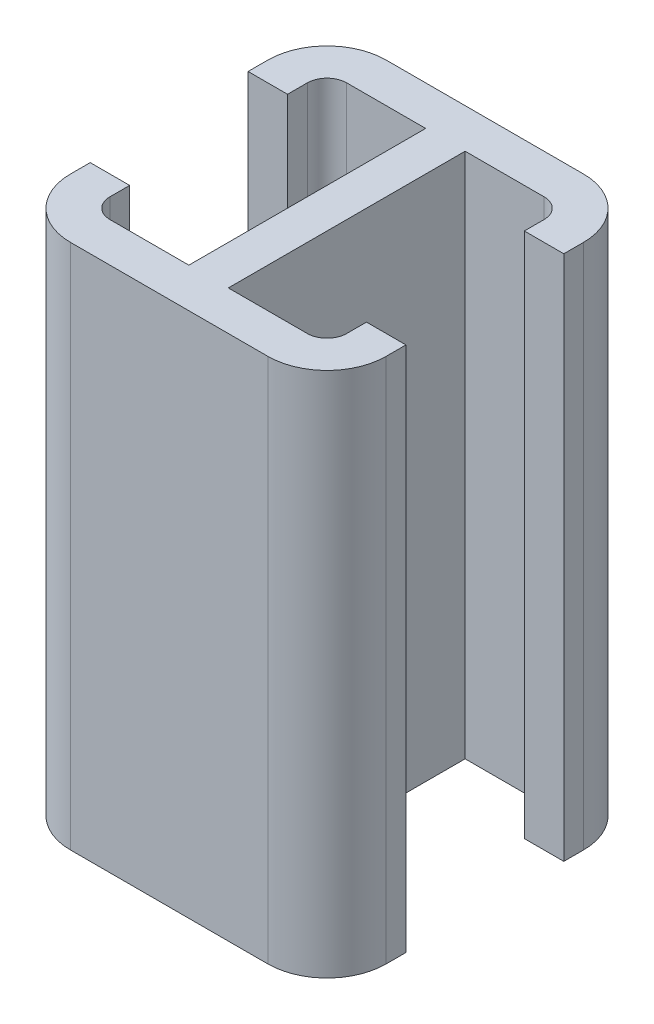
ISO-10303-21;
HEADER;
FILE_DESCRIPTION(('STEP AP214'),'2;1');
FILE_NAME('part.step','',(''),(''),'','','');
FILE_SCHEMA(('AUTOMOTIVE_DESIGN { 1 0 10303 214 1 1 1 1 }'));
ENDSEC;
DATA;
#1=APPLICATION_CONTEXT('core data for automotive mechanical design processes');
#2=APPLICATION_PROTOCOL_DEFINITION('international standard','automotive_design',2000,#1);
#3=PRODUCT_CONTEXT('',#1,'mechanical');
#4=PRODUCT('Part','Part','',(#3));
#5=PRODUCT_RELATED_PRODUCT_CATEGORY('part','',(#4));
#6=PRODUCT_DEFINITION_FORMATION('','',#4);
#7=PRODUCT_DEFINITION_CONTEXT('part definition',#1,'design');
#8=PRODUCT_DEFINITION('design','',#6,#7);
#9=PRODUCT_DEFINITION_SHAPE('','',#8);
#10=(LENGTH_UNIT() NAMED_UNIT(*) SI_UNIT(.MILLI.,.METRE.));
#11=(NAMED_UNIT(*) PLANE_ANGLE_UNIT() SI_UNIT($,.RADIAN.));
#12=(NAMED_UNIT(*) SI_UNIT($,.STERADIAN.) SOLID_ANGLE_UNIT());
#13=UNCERTAINTY_MEASURE_WITH_UNIT(LENGTH_MEASURE(1.E-05),#10,'distance_accuracy_value','');
#14=(GEOMETRIC_REPRESENTATION_CONTEXT(3) GLOBAL_UNCERTAINTY_ASSIGNED_CONTEXT((#13)) GLOBAL_UNIT_ASSIGNED_CONTEXT((#10,
#11,#12)) REPRESENTATION_CONTEXT('',''));
#15=CARTESIAN_POINT('',(0.,0.,0.));
#16=DIRECTION('',(0.,0.,1.));
#17=DIRECTION('',(1.,0.,0.));
#18=AXIS2_PLACEMENT_3D('',#15,#16,#17);
#19=CARTESIAN_POINT('',(0.,200.,0.));
#20=DIRECTION('',(1.,0.,0.));
#21=DIRECTION('',(0.,0.,-1.));
#22=AXIS2_PLACEMENT_3D('',#19,#20,#21);
#23=PLANE('',#22);
#24=DIRECTION('',(0.,0.,1.));
#25=VECTOR('',#24,1.);
#26=CARTESIAN_POINT('',(0.,0.,0.));
#27=LINE('',#26,#25);
#28=CARTESIAN_POINT('',(0.,0.,-30.));
#29=VERTEX_POINT('',#28);
#30=CARTESIAN_POINT('',(0.,0.,-22.5));
#31=VERTEX_POINT('',#30);
#32=EDGE_CURVE('E314',#29,#31,#27,.T.);
#33=ORIENTED_EDGE('',*,*,#32,.T.);
#34=DIRECTION('',(0.,-1.,0.));
#35=VECTOR('',#34,1.);
#36=CARTESIAN_POINT('',(0.,200.,-22.5));
#37=LINE('',#36,#35);
#38=CARTESIAN_POINT('',(0.,200.,-22.5));
#39=VERTEX_POINT('',#38);
#40=EDGE_CURVE('E462',#31,#39,#37,.F.);
#41=ORIENTED_EDGE('',*,*,#40,.T.);
#42=DIRECTION('',(0.,0.,1.));
#43=VECTOR('',#42,1.);
#44=CARTESIAN_POINT('',(0.,200.,0.));
#45=LINE('',#44,#43);
#46=CARTESIAN_POINT('',(0.,200.,-30.));
#47=VERTEX_POINT('',#46);
#48=EDGE_CURVE('E380',#47,#39,#45,.T.);
#49=ORIENTED_EDGE('',*,*,#48,.F.);
#50=DIRECTION('',(0.,-1.,0.));
#51=VECTOR('',#50,1.);
#52=CARTESIAN_POINT('',(0.,200.,-30.));
#53=LINE('',#52,#51);
#54=EDGE_CURVE('E313',#47,#29,#53,.T.);
#55=ORIENTED_EDGE('',*,*,#54,.T.);
#56=EDGE_LOOP('',(#33,#41,#49,#55));
#57=FACE_BOUND('',#56,.T.);
#58=ADVANCED_FACE('F42',(#57),#23,.F.);
#59=CARTESIAN_POINT('',(0.,200.,0.));
#60=DIRECTION('',(0.,0.,-1.));
#61=DIRECTION('',(-1.,0.,0.));
#62=AXIS2_PLACEMENT_3D('',#59,#60,#61);
#63=PLANE('',#62);
#64=DIRECTION('',(1.,0.,0.));
#65=VECTOR('',#64,1.);
#66=CARTESIAN_POINT('',(0.,200.,0.));
#67=LINE('',#66,#65);
#68=CARTESIAN_POINT('',(22.5,200.,0.));
#69=VERTEX_POINT('',#68);
#70=CARTESIAN_POINT('',(97.5,200.,0.));
#71=VERTEX_POINT('',#70);
#72=EDGE_CURVE('E242',#69,#71,#67,.T.);
#73=ORIENTED_EDGE('',*,*,#72,.F.);
#74=DIRECTION('',(0.,-1.,0.));
#75=VECTOR('',#74,1.);
#76=CARTESIAN_POINT('',(22.5,200.,0.));
#77=LINE('',#76,#75);
#78=CARTESIAN_POINT('',(22.5,0.,0.));
#79=VERTEX_POINT('',#78);
#80=EDGE_CURVE('E458',#69,#79,#77,.T.);
#81=ORIENTED_EDGE('',*,*,#80,.T.);
#82=DIRECTION('',(1.,0.,0.));
#83=VECTOR('',#82,1.);
#84=CARTESIAN_POINT('',(0.,0.,0.));
#85=LINE('',#84,#83);
#86=CARTESIAN_POINT('',(97.5,0.,0.));
#87=VERTEX_POINT('',#86);
#88=EDGE_CURVE('E318',#79,#87,#85,.T.);
#89=ORIENTED_EDGE('',*,*,#88,.T.);
#90=DIRECTION('',(0.,-1.,0.));
#91=VECTOR('',#90,1.);
#92=CARTESIAN_POINT('',(97.5,200.,0.));
#93=LINE('',#92,#91);
#94=EDGE_CURVE('E455',#87,#71,#93,.F.);
#95=ORIENTED_EDGE('',*,*,#94,.T.);
#96=EDGE_LOOP('',(#73,#81,#89,#95));
#97=FACE_BOUND('',#96,.T.);
#98=ADVANCED_FACE('F601',(#97),#63,.F.);
#99=CARTESIAN_POINT('',(120.,200.,0.));
#100=DIRECTION('',(-1.,0.,0.));
#101=DIRECTION('',(0.,0.,1.));
#102=AXIS2_PLACEMENT_3D('',#99,#100,#101);
#103=PLANE('',#102);
#104=DIRECTION('',(0.,0.,-1.));
#105=VECTOR('',#104,1.);
#106=CARTESIAN_POINT('',(120.,200.,0.));
#107=LINE('',#106,#105);
#108=CARTESIAN_POINT('',(120.,200.,-22.5));
#109=VERTEX_POINT('',#108);
#110=CARTESIAN_POINT('',(120.,200.,-30.));
#111=VERTEX_POINT('',#110);
#112=EDGE_CURVE('E227',#109,#111,#107,.T.);
#113=ORIENTED_EDGE('',*,*,#112,.F.);
#114=DIRECTION('',(0.,-1.,0.));
#115=VECTOR('',#114,1.);
#116=CARTESIAN_POINT('',(120.,200.,-22.5));
#117=LINE('',#116,#115);
#118=CARTESIAN_POINT('',(120.,0.,-22.5));
#119=VERTEX_POINT('',#118);
#120=EDGE_CURVE('E465',#109,#119,#117,.T.);
#121=ORIENTED_EDGE('',*,*,#120,.T.);
#122=DIRECTION('',(0.,0.,-1.));
#123=VECTOR('',#122,1.);
#124=CARTESIAN_POINT('',(120.,0.,0.));
#125=LINE('',#124,#123);
#126=CARTESIAN_POINT('',(120.,0.,-30.));
#127=VERTEX_POINT('',#126);
#128=EDGE_CURVE('E248',#119,#127,#125,.T.);
#129=ORIENTED_EDGE('',*,*,#128,.T.);
#130=DIRECTION('',(0.,-1.,0.));
#131=VECTOR('',#130,1.);
#132=CARTESIAN_POINT('',(120.,200.,-30.));
#133=LINE('',#132,#131);
#134=EDGE_CURVE('E245',#111,#127,#133,.T.);
#135=ORIENTED_EDGE('',*,*,#134,.F.);
#136=EDGE_LOOP('',(#113,#121,#129,#135));
#137=FACE_BOUND('',#136,.T.);
#138=ADVANCED_FACE('F246',(#137),#103,.F.);
#139=CARTESIAN_POINT('',(105.,200.,-30.));
#140=DIRECTION('',(0.,0.,1.));
#141=DIRECTION('',(1.,0.,0.));
#142=AXIS2_PLACEMENT_3D('',#139,#140,#141);
#143=PLANE('',#142);
#144=DIRECTION('',(-1.,0.,0.));
#145=VECTOR('',#144,1.);
#146=CARTESIAN_POINT('',(105.,0.,-30.));
#147=LINE('',#146,#145);
#148=CARTESIAN_POINT('',(105.,0.,-30.));
#149=VERTEX_POINT('',#148);
#150=EDGE_CURVE('E324',#127,#149,#147,.T.);
#151=ORIENTED_EDGE('',*,*,#150,.T.);
#152=DIRECTION('',(0.,-1.,0.));
#153=VECTOR('',#152,1.);
#154=CARTESIAN_POINT('',(105.,200.,-30.));
#155=LINE('',#154,#153);
#156=CARTESIAN_POINT('',(105.,200.,-30.));
#157=VERTEX_POINT('',#156);
#158=EDGE_CURVE('E253',#157,#149,#155,.T.);
#159=ORIENTED_EDGE('',*,*,#158,.F.);
#160=DIRECTION('',(-1.,0.,0.));
#161=VECTOR('',#160,1.);
#162=CARTESIAN_POINT('',(105.,200.,-30.));
#163=LINE('',#162,#161);
#164=EDGE_CURVE('E233',#111,#157,#163,.T.);
#165=ORIENTED_EDGE('',*,*,#164,.F.);
#166=ORIENTED_EDGE('',*,*,#134,.T.);
#167=EDGE_LOOP('',(#151,#159,#165,#166));
#168=FACE_BOUND('',#167,.T.);
#169=ADVANCED_FACE('F255',(#168),#143,.F.);
#170=CARTESIAN_POINT('',(105.,200.,-30.));
#171=DIRECTION('',(1.,0.,0.));
#172=DIRECTION('',(0.,0.,-1.));
#173=AXIS2_PLACEMENT_3D('',#170,#171,#172);
#174=PLANE('',#173);
#175=DIRECTION('',(0.,0.,1.));
#176=VECTOR('',#175,1.);
#177=CARTESIAN_POINT('',(105.,0.,-30.));
#178=LINE('',#177,#176);
#179=CARTESIAN_POINT('',(105.,0.,-22.5));
#180=VERTEX_POINT('',#179);
#181=EDGE_CURVE('E327',#149,#180,#178,.T.);
#182=ORIENTED_EDGE('',*,*,#181,.T.);
#183=DIRECTION('',(0.,-1.,0.));
#184=VECTOR('',#183,1.);
#185=CARTESIAN_POINT('',(105.,200.,-22.5));
#186=LINE('',#185,#184);
#187=CARTESIAN_POINT('',(105.,200.,-22.5));
#188=VERTEX_POINT('',#187);
#189=EDGE_CURVE('E482',#180,#188,#186,.F.);
#190=ORIENTED_EDGE('',*,*,#189,.T.);
#191=DIRECTION('',(0.,0.,1.));
#192=VECTOR('',#191,1.);
#193=CARTESIAN_POINT('',(105.,200.,-30.));
#194=LINE('',#193,#192);
#195=EDGE_CURVE('E259',#157,#188,#194,.T.);
#196=ORIENTED_EDGE('',*,*,#195,.F.);
#197=ORIENTED_EDGE('',*,*,#158,.T.);
#198=EDGE_LOOP('',(#182,#190,#196,#197));
#199=FACE_BOUND('',#198,.T.);
#200=ADVANCED_FACE('F591',(#199),#174,.F.);
#201=CARTESIAN_POINT('',(67.5,200.,-15.));
#202=DIRECTION('',(0.,0.,1.));
#203=DIRECTION('',(1.,0.,0.));
#204=AXIS2_PLACEMENT_3D('',#201,#202,#203);
#205=PLANE('',#204);
#206=DIRECTION('',(-1.,0.,0.));
#207=VECTOR('',#206,1.);
#208=CARTESIAN_POINT('',(67.5,200.,-15.));
#209=LINE('',#208,#207);
#210=CARTESIAN_POINT('',(97.5,200.,-15.));
#211=VERTEX_POINT('',#210);
#212=CARTESIAN_POINT('',(67.5,200.,-15.));
#213=VERTEX_POINT('',#212);
#214=EDGE_CURVE('E262',#211,#213,#209,.T.);
#215=ORIENTED_EDGE('',*,*,#214,.F.);
#216=DIRECTION('',(0.,-1.,0.));
#217=VECTOR('',#216,1.);
#218=CARTESIAN_POINT('',(97.5,0.,-15.));
#219=LINE('',#218,#217);
#220=CARTESIAN_POINT('',(97.5,0.,-15.));
#221=VERTEX_POINT('',#220);
#222=EDGE_CURVE('E478',#211,#221,#219,.T.);
#223=ORIENTED_EDGE('',*,*,#222,.T.);
#224=DIRECTION('',(-1.,0.,0.));
#225=VECTOR('',#224,1.);
#226=CARTESIAN_POINT('',(67.5,0.,-15.));
#227=LINE('',#226,#225);
#228=CARTESIAN_POINT('',(67.5,0.,-15.));
#229=VERTEX_POINT('',#228);
#230=EDGE_CURVE('E331',#221,#229,#227,.T.);
#231=ORIENTED_EDGE('',*,*,#230,.T.);
#232=DIRECTION('',(0.,-1.,0.));
#233=VECTOR('',#232,1.);
#234=CARTESIAN_POINT('',(67.5,200.,-15.));
#235=LINE('',#234,#233);
#236=EDGE_CURVE('E416',#213,#229,#235,.T.);
#237=ORIENTED_EDGE('',*,*,#236,.F.);
#238=EDGE_LOOP('',(#215,#223,#231,#237));
#239=FACE_BOUND('',#238,.T.);
#240=ADVANCED_FACE('F583',(#239),#205,.F.);
#241=CARTESIAN_POINT('',(67.5,200.,-105.));
#242=DIRECTION('',(-1.,0.,0.));
#243=DIRECTION('',(0.,0.,1.));
#244=AXIS2_PLACEMENT_3D('',#241,#242,#243);
#245=PLANE('',#244);
#246=DIRECTION('',(0.,0.,-1.));
#247=VECTOR('',#246,1.);
#248=CARTESIAN_POINT('',(67.5,0.,-105.));
#249=LINE('',#248,#247);
#250=CARTESIAN_POINT('',(67.5,0.,-105.));
#251=VERTEX_POINT('',#250);
#252=EDGE_CURVE('E334',#229,#251,#249,.T.);
#253=ORIENTED_EDGE('',*,*,#252,.T.);
#254=DIRECTION('',(0.,-1.,0.));
#255=VECTOR('',#254,1.);
#256=CARTESIAN_POINT('',(67.5,200.,-105.));
#257=LINE('',#256,#255);
#258=CARTESIAN_POINT('',(67.5,200.,-105.));
#259=VERTEX_POINT('',#258);
#260=EDGE_CURVE('E412',#259,#251,#257,.T.);
#261=ORIENTED_EDGE('',*,*,#260,.F.);
#262=DIRECTION('',(0.,0.,-1.));
#263=VECTOR('',#262,1.);
#264=CARTESIAN_POINT('',(67.5,200.,-105.));
#265=LINE('',#264,#263);
#266=EDGE_CURVE('E268',#213,#259,#265,.T.);
#267=ORIENTED_EDGE('',*,*,#266,.F.);
#268=ORIENTED_EDGE('',*,*,#236,.T.);
#269=EDGE_LOOP('',(#253,#261,#267,#268));
#270=FACE_BOUND('',#269,.T.);
#271=ADVANCED_FACE('F579',(#270),#245,.F.);
#272=CARTESIAN_POINT('',(67.5,200.,-105.));
#273=DIRECTION('',(0.,0.,-1.));
#274=DIRECTION('',(-1.,0.,0.));
#275=AXIS2_PLACEMENT_3D('',#272,#273,#274);
#276=PLANE('',#275);
#277=DIRECTION('',(1.,0.,0.));
#278=VECTOR('',#277,1.);
#279=CARTESIAN_POINT('',(67.5,0.,-105.));
#280=LINE('',#279,#278);
#281=CARTESIAN_POINT('',(97.5,0.,-105.));
#282=VERTEX_POINT('',#281);
#283=EDGE_CURVE('E337',#251,#282,#280,.T.);
#284=ORIENTED_EDGE('',*,*,#283,.T.);
#285=DIRECTION('',(0.,-1.,0.));
#286=VECTOR('',#285,1.);
#287=CARTESIAN_POINT('',(97.5,200.,-105.));
#288=LINE('',#287,#286);
#289=CARTESIAN_POINT('',(97.5,200.,-105.));
#290=VERTEX_POINT('',#289);
#291=EDGE_CURVE('E58',#282,#290,#288,.F.);
#292=ORIENTED_EDGE('',*,*,#291,.T.);
#293=DIRECTION('',(1.,0.,0.));
#294=VECTOR('',#293,1.);
#295=CARTESIAN_POINT('',(67.5,200.,-105.));
#296=LINE('',#295,#294);
#297=EDGE_CURVE('E271',#259,#290,#296,.T.);
#298=ORIENTED_EDGE('',*,*,#297,.F.);
#299=ORIENTED_EDGE('',*,*,#260,.T.);
#300=EDGE_LOOP('',(#284,#292,#298,#299));
#301=FACE_BOUND('',#300,.T.);
#302=ADVANCED_FACE('F575',(#301),#276,.F.);
#303=CARTESIAN_POINT('',(105.,200.,-105.));
#304=DIRECTION('',(1.,0.,0.));
#305=DIRECTION('',(0.,0.,-1.));
#306=AXIS2_PLACEMENT_3D('',#303,#304,#305);
#307=PLANE('',#306);
#308=DIRECTION('',(0.,0.,1.));
#309=VECTOR('',#308,1.);
#310=CARTESIAN_POINT('',(105.,200.,-105.));
#311=LINE('',#310,#309);
#312=CARTESIAN_POINT('',(105.,200.,-97.5));
#313=VERTEX_POINT('',#312);
#314=CARTESIAN_POINT('',(105.,200.,-90.));
#315=VERTEX_POINT('',#314);
#316=EDGE_CURVE('E274',#313,#315,#311,.T.);
#317=ORIENTED_EDGE('',*,*,#316,.F.);
#318=DIRECTION('',(0.,-1.,0.));
#319=VECTOR('',#318,1.);
#320=CARTESIAN_POINT('',(105.,0.,-97.5));
#321=LINE('',#320,#319);
#322=CARTESIAN_POINT('',(105.,0.,-97.5));
#323=VERTEX_POINT('',#322);
#324=EDGE_CURVE('E492',#313,#323,#321,.T.);
#325=ORIENTED_EDGE('',*,*,#324,.T.);
#326=DIRECTION('',(0.,0.,1.));
#327=VECTOR('',#326,1.);
#328=CARTESIAN_POINT('',(105.,0.,-105.));
#329=LINE('',#328,#327);
#330=CARTESIAN_POINT('',(105.,0.,-90.));
#331=VERTEX_POINT('',#330);
#332=EDGE_CURVE('E340',#323,#331,#329,.T.);
#333=ORIENTED_EDGE('',*,*,#332,.T.);
#334=DIRECTION('',(0.,-1.,0.));
#335=VECTOR('',#334,1.);
#336=CARTESIAN_POINT('',(105.,200.,-90.));
#337=LINE('',#336,#335);
#338=EDGE_CURVE('E408',#315,#331,#337,.T.);
#339=ORIENTED_EDGE('',*,*,#338,.F.);
#340=EDGE_LOOP('',(#317,#325,#333,#339));
#341=FACE_BOUND('',#340,.T.);
#342=ADVANCED_FACE('F569',(#341),#307,.F.);
#343=CARTESIAN_POINT('',(105.,200.,-90.));
#344=DIRECTION('',(0.,0.,-1.));
#345=DIRECTION('',(-1.,0.,0.));
#346=AXIS2_PLACEMENT_3D('',#343,#344,#345);
#347=PLANE('',#346);
#348=DIRECTION('',(1.,0.,0.));
#349=VECTOR('',#348,1.);
#350=CARTESIAN_POINT('',(105.,0.,-90.));
#351=LINE('',#350,#349);
#352=CARTESIAN_POINT('',(120.,0.,-90.));
#353=VERTEX_POINT('',#352);
#354=EDGE_CURVE('E343',#331,#353,#351,.T.);
#355=ORIENTED_EDGE('',*,*,#354,.T.);
#356=DIRECTION('',(0.,-1.,0.));
#357=VECTOR('',#356,1.);
#358=CARTESIAN_POINT('',(120.,200.,-90.));
#359=LINE('',#358,#357);
#360=CARTESIAN_POINT('',(120.,200.,-90.));
#361=VERTEX_POINT('',#360);
#362=EDGE_CURVE('E404',#361,#353,#359,.T.);
#363=ORIENTED_EDGE('',*,*,#362,.F.);
#364=DIRECTION('',(1.,0.,0.));
#365=VECTOR('',#364,1.);
#366=CARTESIAN_POINT('',(105.,200.,-90.));
#367=LINE('',#366,#365);
#368=EDGE_CURVE('E277',#315,#361,#367,.T.);
#369=ORIENTED_EDGE('',*,*,#368,.F.);
#370=ORIENTED_EDGE('',*,*,#338,.T.);
#371=EDGE_LOOP('',(#355,#363,#369,#370));
#372=FACE_BOUND('',#371,.T.);
#373=ADVANCED_FACE('F565',(#372),#347,.F.);
#374=CARTESIAN_POINT('',(120.,200.,-90.));
#375=DIRECTION('',(-1.,0.,0.));
#376=DIRECTION('',(0.,0.,1.));
#377=AXIS2_PLACEMENT_3D('',#374,#375,#376);
#378=PLANE('',#377);
#379=DIRECTION('',(0.,0.,-1.));
#380=VECTOR('',#379,1.);
#381=CARTESIAN_POINT('',(120.,0.,-90.));
#382=LINE('',#381,#380);
#383=CARTESIAN_POINT('',(120.,0.,-97.5));
#384=VERTEX_POINT('',#383);
#385=EDGE_CURVE('E346',#353,#384,#382,.T.);
#386=ORIENTED_EDGE('',*,*,#385,.T.);
#387=DIRECTION('',(0.,-1.,0.));
#388=VECTOR('',#387,1.);
#389=CARTESIAN_POINT('',(120.,200.,-97.5));
#390=LINE('',#389,#388);
#391=CARTESIAN_POINT('',(120.,200.,-97.5));
#392=VERTEX_POINT('',#391);
#393=EDGE_CURVE('E468',#384,#392,#390,.F.);
#394=ORIENTED_EDGE('',*,*,#393,.T.);
#395=DIRECTION('',(0.,0.,-1.));
#396=VECTOR('',#395,1.);
#397=CARTESIAN_POINT('',(120.,200.,-90.));
#398=LINE('',#397,#396);
#399=EDGE_CURVE('E280',#361,#392,#398,.T.);
#400=ORIENTED_EDGE('',*,*,#399,.F.);
#401=ORIENTED_EDGE('',*,*,#362,.T.);
#402=EDGE_LOOP('',(#386,#394,#400,#401));
#403=FACE_BOUND('',#402,.T.);
#404=ADVANCED_FACE('F561',(#403),#378,.F.);
#405=CARTESIAN_POINT('',(0.,200.,-120.));
#406=DIRECTION('',(0.,0.,1.));
#407=DIRECTION('',(1.,0.,0.));
#408=AXIS2_PLACEMENT_3D('',#405,#406,#407);
#409=PLANE('',#408);
#410=DIRECTION('',(-1.,0.,0.));
#411=VECTOR('',#410,1.);
#412=CARTESIAN_POINT('',(0.,0.,-120.));
#413=LINE('',#412,#411);
#414=CARTESIAN_POINT('',(97.5,0.,-120.));
#415=VERTEX_POINT('',#414);
#416=CARTESIAN_POINT('',(22.5,0.,-120.));
#417=VERTEX_POINT('',#416);
#418=EDGE_CURVE('E350',#415,#417,#413,.T.);
#419=ORIENTED_EDGE('',*,*,#418,.T.);
#420=DIRECTION('',(0.,-1.,0.));
#421=VECTOR('',#420,1.);
#422=CARTESIAN_POINT('',(22.5,200.,-120.));
#423=LINE('',#422,#421);
#424=CARTESIAN_POINT('',(22.5,200.,-120.));
#425=VERTEX_POINT('',#424);
#426=EDGE_CURVE('E441',#417,#425,#423,.F.);
#427=ORIENTED_EDGE('',*,*,#426,.T.);
#428=DIRECTION('',(-1.,0.,0.));
#429=VECTOR('',#428,1.);
#430=CARTESIAN_POINT('',(0.,200.,-120.));
#431=LINE('',#430,#429);
#432=CARTESIAN_POINT('',(97.5,200.,-120.));
#433=VERTEX_POINT('',#432);
#434=EDGE_CURVE('E284',#433,#425,#431,.T.);
#435=ORIENTED_EDGE('',*,*,#434,.F.);
#436=DIRECTION('',(0.,-1.,0.));
#437=VECTOR('',#436,1.);
#438=CARTESIAN_POINT('',(97.5,200.,-120.));
#439=LINE('',#438,#437);
#440=EDGE_CURVE('E437',#433,#415,#439,.T.);
#441=ORIENTED_EDGE('',*,*,#440,.T.);
#442=EDGE_LOOP('',(#419,#427,#435,#441));
#443=FACE_BOUND('',#442,.T.);
#444=ADVANCED_FACE('F551',(#443),#409,.F.);
#445=CARTESIAN_POINT('',(0.,200.,-90.));
#446=DIRECTION('',(1.,0.,0.));
#447=DIRECTION('',(0.,0.,-1.));
#448=AXIS2_PLACEMENT_3D('',#445,#446,#447);
#449=PLANE('',#448);
#450=DIRECTION('',(0.,0.,1.));
#451=VECTOR('',#450,1.);
#452=CARTESIAN_POINT('',(0.,200.,-90.));
#453=LINE('',#452,#451);
#454=CARTESIAN_POINT('',(0.,200.,-97.5));
#455=VERTEX_POINT('',#454);
#456=CARTESIAN_POINT('',(0.,200.,-90.));
#457=VERTEX_POINT('',#456);
#458=EDGE_CURVE('E287',#455,#457,#453,.T.);
#459=ORIENTED_EDGE('',*,*,#458,.F.);
#460=DIRECTION('',(0.,-1.,0.));
#461=VECTOR('',#460,1.);
#462=CARTESIAN_POINT('',(0.,200.,-97.5));
#463=LINE('',#462,#461);
#464=CARTESIAN_POINT('',(0.,0.,-97.5));
#465=VERTEX_POINT('',#464);
#466=EDGE_CURVE('E252',#455,#465,#463,.T.);
#467=ORIENTED_EDGE('',*,*,#466,.T.);
#468=DIRECTION('',(0.,0.,1.));
#469=VECTOR('',#468,1.);
#470=CARTESIAN_POINT('',(0.,0.,-90.));
#471=LINE('',#470,#469);
#472=CARTESIAN_POINT('',(0.,0.,-90.));
#473=VERTEX_POINT('',#472);
#474=EDGE_CURVE('E354',#465,#473,#471,.T.);
#475=ORIENTED_EDGE('',*,*,#474,.T.);
#476=DIRECTION('',(0.,-1.,0.));
#477=VECTOR('',#476,1.);
#478=CARTESIAN_POINT('',(0.,200.,-90.));
#479=LINE('',#478,#477);
#480=EDGE_CURVE('E400',#457,#473,#479,.T.);
#481=ORIENTED_EDGE('',*,*,#480,.F.);
#482=EDGE_LOOP('',(#459,#467,#475,#481));
#483=FACE_BOUND('',#482,.T.);
#484=ADVANCED_FACE('F543',(#483),#449,.F.);
#485=CARTESIAN_POINT('',(15.,200.,-90.));
#486=DIRECTION('',(0.,0.,-1.));
#487=DIRECTION('',(-1.,0.,0.));
#488=AXIS2_PLACEMENT_3D('',#485,#486,#487);
#489=PLANE('',#488);
#490=DIRECTION('',(1.,0.,0.));
#491=VECTOR('',#490,1.);
#492=CARTESIAN_POINT('',(15.,0.,-90.));
#493=LINE('',#492,#491);
#494=CARTESIAN_POINT('',(15.,0.,-90.));
#495=VERTEX_POINT('',#494);
#496=EDGE_CURVE('E357',#473,#495,#493,.T.);
#497=ORIENTED_EDGE('',*,*,#496,.T.);
#498=DIRECTION('',(0.,-1.,0.));
#499=VECTOR('',#498,1.);
#500=CARTESIAN_POINT('',(15.,200.,-90.));
#501=LINE('',#500,#499);
#502=CARTESIAN_POINT('',(15.,200.,-90.));
#503=VERTEX_POINT('',#502);
#504=EDGE_CURVE('E396',#503,#495,#501,.T.);
#505=ORIENTED_EDGE('',*,*,#504,.F.);
#506=DIRECTION('',(1.,0.,0.));
#507=VECTOR('',#506,1.);
#508=CARTESIAN_POINT('',(15.,200.,-90.));
#509=LINE('',#508,#507);
#510=EDGE_CURVE('E290',#457,#503,#509,.T.);
#511=ORIENTED_EDGE('',*,*,#510,.F.);
#512=ORIENTED_EDGE('',*,*,#480,.T.);
#513=EDGE_LOOP('',(#497,#505,#511,#512));
#514=FACE_BOUND('',#513,.T.);
#515=ADVANCED_FACE('F538',(#514),#489,.F.);
#516=CARTESIAN_POINT('',(15.,200.,-105.));
#517=DIRECTION('',(-1.,0.,0.));
#518=DIRECTION('',(0.,0.,1.));
#519=AXIS2_PLACEMENT_3D('',#516,#517,#518);
#520=PLANE('',#519);
#521=DIRECTION('',(0.,0.,-1.));
#522=VECTOR('',#521,1.);
#523=CARTESIAN_POINT('',(15.,0.,-105.));
#524=LINE('',#523,#522);
#525=CARTESIAN_POINT('',(15.,0.,-97.5));
#526=VERTEX_POINT('',#525);
#527=EDGE_CURVE('E360',#495,#526,#524,.T.);
#528=ORIENTED_EDGE('',*,*,#527,.T.);
#529=DIRECTION('',(0.,-1.,0.));
#530=VECTOR('',#529,1.);
#531=CARTESIAN_POINT('',(15.,200.,-97.5));
#532=LINE('',#531,#530);
#533=CARTESIAN_POINT('',(15.,200.,-97.5));
#534=VERTEX_POINT('',#533);
#535=EDGE_CURVE('E489',#526,#534,#532,.F.);
#536=ORIENTED_EDGE('',*,*,#535,.T.);
#537=DIRECTION('',(0.,0.,-1.));
#538=VECTOR('',#537,1.);
#539=CARTESIAN_POINT('',(15.,200.,-105.));
#540=LINE('',#539,#538);
#541=EDGE_CURVE('E293',#503,#534,#540,.T.);
#542=ORIENTED_EDGE('',*,*,#541,.F.);
#543=ORIENTED_EDGE('',*,*,#504,.T.);
#544=EDGE_LOOP('',(#528,#536,#542,#543));
#545=FACE_BOUND('',#544,.T.);
#546=ADVANCED_FACE('F534',(#545),#520,.F.);
#547=CARTESIAN_POINT('',(52.5,200.,-105.));
#548=DIRECTION('',(0.,0.,-1.));
#549=DIRECTION('',(-1.,0.,0.));
#550=AXIS2_PLACEMENT_3D('',#547,#548,#549);
#551=PLANE('',#550);
#552=DIRECTION('',(1.,0.,0.));
#553=VECTOR('',#552,1.);
#554=CARTESIAN_POINT('',(52.5,200.,-105.));
#555=LINE('',#554,#553);
#556=CARTESIAN_POINT('',(22.5,200.,-105.));
#557=VERTEX_POINT('',#556);
#558=CARTESIAN_POINT('',(52.5,200.,-105.));
#559=VERTEX_POINT('',#558);
#560=EDGE_CURVE('E297',#557,#559,#555,.T.);
#561=ORIENTED_EDGE('',*,*,#560,.F.);
#562=DIRECTION('',(0.,-1.,0.));
#563=VECTOR('',#562,1.);
#564=CARTESIAN_POINT('',(22.5,0.,-105.));
#565=LINE('',#564,#563);
#566=CARTESIAN_POINT('',(22.5,0.,-105.));
#567=VERTEX_POINT('',#566);
#568=EDGE_CURVE('E485',#557,#567,#565,.T.);
#569=ORIENTED_EDGE('',*,*,#568,.T.);
#570=DIRECTION('',(1.,0.,0.));
#571=VECTOR('',#570,1.);
#572=CARTESIAN_POINT('',(52.5,0.,-105.));
#573=LINE('',#572,#571);
#574=CARTESIAN_POINT('',(52.5,0.,-105.));
#575=VERTEX_POINT('',#574);
#576=EDGE_CURVE('E364',#567,#575,#573,.T.);
#577=ORIENTED_EDGE('',*,*,#576,.T.);
#578=DIRECTION('',(0.,-1.,0.));
#579=VECTOR('',#578,1.);
#580=CARTESIAN_POINT('',(52.5,200.,-105.));
#581=LINE('',#580,#579);
#582=EDGE_CURVE('E392',#559,#575,#581,.T.);
#583=ORIENTED_EDGE('',*,*,#582,.F.);
#584=EDGE_LOOP('',(#561,#569,#577,#583));
#585=FACE_BOUND('',#584,.T.);
#586=ADVANCED_FACE('F524',(#585),#551,.F.);
#587=CARTESIAN_POINT('',(52.5,200.,-105.));
#588=DIRECTION('',(1.,0.,0.));
#589=DIRECTION('',(0.,0.,-1.));
#590=AXIS2_PLACEMENT_3D('',#587,#588,#589);
#591=PLANE('',#590);
#592=DIRECTION('',(0.,0.,1.));
#593=VECTOR('',#592,1.);
#594=CARTESIAN_POINT('',(52.5,0.,-105.));
#595=LINE('',#594,#593);
#596=CARTESIAN_POINT('',(52.5,0.,-15.));
#597=VERTEX_POINT('',#596);
#598=EDGE_CURVE('E367',#575,#597,#595,.T.);
#599=ORIENTED_EDGE('',*,*,#598,.T.);
#600=DIRECTION('',(0.,-1.,0.));
#601=VECTOR('',#600,1.);
#602=CARTESIAN_POINT('',(52.5,200.,-15.));
#603=LINE('',#602,#601);
#604=CARTESIAN_POINT('',(52.5,200.,-15.));
#605=VERTEX_POINT('',#604);
#606=EDGE_CURVE('E388',#605,#597,#603,.T.);
#607=ORIENTED_EDGE('',*,*,#606,.F.);
#608=DIRECTION('',(0.,0.,1.));
#609=VECTOR('',#608,1.);
#610=CARTESIAN_POINT('',(52.5,200.,-105.));
#611=LINE('',#610,#609);
#612=EDGE_CURVE('E300',#559,#605,#611,.T.);
#613=ORIENTED_EDGE('',*,*,#612,.F.);
#614=ORIENTED_EDGE('',*,*,#582,.T.);
#615=EDGE_LOOP('',(#599,#607,#613,#614));
#616=FACE_BOUND('',#615,.T.);
#617=ADVANCED_FACE('F698',(#616),#591,.F.);
#618=CARTESIAN_POINT('',(52.5,200.,-15.));
#619=DIRECTION('',(0.,0.,1.));
#620=DIRECTION('',(1.,0.,0.));
#621=AXIS2_PLACEMENT_3D('',#618,#619,#620);
#622=PLANE('',#621);
#623=DIRECTION('',(-1.,0.,0.));
#624=VECTOR('',#623,1.);
#625=CARTESIAN_POINT('',(52.5,0.,-15.));
#626=LINE('',#625,#624);
#627=CARTESIAN_POINT('',(22.5,0.,-15.));
#628=VERTEX_POINT('',#627);
#629=EDGE_CURVE('E370',#597,#628,#626,.T.);
#630=ORIENTED_EDGE('',*,*,#629,.T.);
#631=DIRECTION('',(0.,-1.,0.));
#632=VECTOR('',#631,1.);
#633=CARTESIAN_POINT('',(22.5,200.,-15.));
#634=LINE('',#633,#632);
#635=CARTESIAN_POINT('',(22.5,200.,-15.));
#636=VERTEX_POINT('',#635);
#637=EDGE_CURVE('E475',#628,#636,#634,.F.);
#638=ORIENTED_EDGE('',*,*,#637,.T.);
#639=DIRECTION('',(-1.,0.,0.));
#640=VECTOR('',#639,1.);
#641=CARTESIAN_POINT('',(52.5,200.,-15.));
#642=LINE('',#641,#640);
#643=EDGE_CURVE('E303',#605,#636,#642,.T.);
#644=ORIENTED_EDGE('',*,*,#643,.F.);
#645=ORIENTED_EDGE('',*,*,#606,.T.);
#646=EDGE_LOOP('',(#630,#638,#644,#645));
#647=FACE_BOUND('',#646,.T.);
#648=ADVANCED_FACE('F687',(#647),#622,.F.);
#649=CARTESIAN_POINT('',(15.,200.,-30.));
#650=DIRECTION('',(-1.,0.,0.));
#651=DIRECTION('',(0.,0.,1.));
#652=AXIS2_PLACEMENT_3D('',#649,#650,#651);
#653=PLANE('',#652);
#654=DIRECTION('',(0.,0.,-1.));
#655=VECTOR('',#654,1.);
#656=CARTESIAN_POINT('',(15.,200.,-30.));
#657=LINE('',#656,#655);
#658=CARTESIAN_POINT('',(15.,200.,-22.5));
#659=VERTEX_POINT('',#658);
#660=CARTESIAN_POINT('',(15.,200.,-30.));
#661=VERTEX_POINT('',#660);
#662=EDGE_CURVE('E307',#659,#661,#657,.T.);
#663=ORIENTED_EDGE('',*,*,#662,.F.);
#664=DIRECTION('',(0.,-1.,0.));
#665=VECTOR('',#664,1.);
#666=CARTESIAN_POINT('',(15.,0.,-22.5));
#667=LINE('',#666,#665);
#668=CARTESIAN_POINT('',(15.,0.,-22.5));
#669=VERTEX_POINT('',#668);
#670=EDGE_CURVE('E471',#659,#669,#667,.T.);
#671=ORIENTED_EDGE('',*,*,#670,.T.);
#672=DIRECTION('',(0.,0.,-1.));
#673=VECTOR('',#672,1.);
#674=CARTESIAN_POINT('',(15.,0.,-30.));
#675=LINE('',#674,#673);
#676=CARTESIAN_POINT('',(15.,0.,-30.));
#677=VERTEX_POINT('',#676);
#678=EDGE_CURVE('E374',#669,#677,#675,.T.);
#679=ORIENTED_EDGE('',*,*,#678,.T.);
#680=DIRECTION('',(0.,-1.,0.));
#681=VECTOR('',#680,1.);
#682=CARTESIAN_POINT('',(15.,200.,-30.));
#683=LINE('',#682,#681);
#684=EDGE_CURVE('E384',#661,#677,#683,.T.);
#685=ORIENTED_EDGE('',*,*,#684,.F.);
#686=EDGE_LOOP('',(#663,#671,#679,#685));
#687=FACE_BOUND('',#686,.T.);
#688=ADVANCED_FACE('F682',(#687),#653,.F.);
#689=CARTESIAN_POINT('',(15.,200.,-30.));
#690=DIRECTION('',(0.,0.,1.));
#691=DIRECTION('',(1.,0.,0.));
#692=AXIS2_PLACEMENT_3D('',#689,#690,#691);
#693=PLANE('',#692);
#694=DIRECTION('',(-1.,0.,0.));
#695=VECTOR('',#694,1.);
#696=CARTESIAN_POINT('',(15.,0.,-30.));
#697=LINE('',#696,#695);
#698=EDGE_CURVE('E377',#677,#29,#697,.T.);
#699=ORIENTED_EDGE('',*,*,#698,.T.);
#700=ORIENTED_EDGE('',*,*,#54,.F.);
#701=DIRECTION('',(-1.,0.,0.));
#702=VECTOR('',#701,1.);
#703=CARTESIAN_POINT('',(15.,200.,-30.));
#704=LINE('',#703,#702);
#705=EDGE_CURVE('E310',#661,#47,#704,.T.);
#706=ORIENTED_EDGE('',*,*,#705,.F.);
#707=ORIENTED_EDGE('',*,*,#684,.T.);
#708=EDGE_LOOP('',(#699,#700,#706,#707));
#709=FACE_BOUND('',#708,.T.);
#710=ADVANCED_FACE('F674',(#709),#693,.F.);
#711=CARTESIAN_POINT('',(0.,200.,0.));
#712=DIRECTION('',(0.,1.,0.));
#713=DIRECTION('',(0.,0.,1.));
#714=AXIS2_PLACEMENT_3D('',#711,#712,#713);
#715=PLANE('',#714);
#716=ORIENTED_EDGE('',*,*,#434,.T.);
#717=CARTESIAN_POINT('',(22.5,200.,-97.5));
#718=DIRECTION('',(0.,1.,0.));
#719=DIRECTION('',(0.,0.,1.));
#720=AXIS2_PLACEMENT_3D('',#717,#718,#719);
#721=CIRCLE('',#720,22.5);
#722=EDGE_CURVE('E452',#425,#455,#721,.T.);
#723=ORIENTED_EDGE('',*,*,#722,.T.);
#724=ORIENTED_EDGE('',*,*,#458,.T.);
#725=ORIENTED_EDGE('',*,*,#510,.T.);
#726=ORIENTED_EDGE('',*,*,#541,.T.);
#727=CARTESIAN_POINT('',(22.5,200.,-97.5));
#728=DIRECTION('',(0.,1.,0.));
#729=DIRECTION('',(0.,0.,1.));
#730=AXIS2_PLACEMENT_3D('',#727,#728,#729);
#731=CIRCLE('',#730,7.5);
#732=EDGE_CURVE('E513',#534,#557,#731,.F.);
#733=ORIENTED_EDGE('',*,*,#732,.T.);
#734=ORIENTED_EDGE('',*,*,#560,.T.);
#735=ORIENTED_EDGE('',*,*,#612,.T.);
#736=ORIENTED_EDGE('',*,*,#643,.T.);
#737=CARTESIAN_POINT('',(22.5,200.,-22.5));
#738=DIRECTION('',(0.,1.,0.));
#739=DIRECTION('',(0.,0.,1.));
#740=AXIS2_PLACEMENT_3D('',#737,#738,#739);
#741=CIRCLE('',#740,7.5);
#742=EDGE_CURVE('E501',#636,#659,#741,.F.);
#743=ORIENTED_EDGE('',*,*,#742,.T.);
#744=ORIENTED_EDGE('',*,*,#662,.T.);
#745=ORIENTED_EDGE('',*,*,#705,.T.);
#746=ORIENTED_EDGE('',*,*,#48,.T.);
#747=CARTESIAN_POINT('',(22.5,200.,-22.5));
#748=DIRECTION('',(0.,1.,0.));
#749=DIRECTION('',(0.,0.,1.));
#750=AXIS2_PLACEMENT_3D('',#747,#748,#749);
#751=CIRCLE('',#750,22.5);
#752=EDGE_CURVE('E449',#39,#69,#751,.T.);
#753=ORIENTED_EDGE('',*,*,#752,.T.);
#754=ORIENTED_EDGE('',*,*,#72,.T.);
#755=CARTESIAN_POINT('',(97.5,200.,-22.5));
#756=DIRECTION('',(0.,1.,0.));
#757=DIRECTION('',(0.,0.,1.));
#758=AXIS2_PLACEMENT_3D('',#755,#756,#757);
#759=CIRCLE('',#758,22.5);
#760=EDGE_CURVE('E237',#71,#109,#759,.T.);
#761=ORIENTED_EDGE('',*,*,#760,.T.);
#762=ORIENTED_EDGE('',*,*,#112,.T.);
#763=ORIENTED_EDGE('',*,*,#164,.T.);
#764=ORIENTED_EDGE('',*,*,#195,.T.);
#765=CARTESIAN_POINT('',(97.5,200.,-22.5));
#766=DIRECTION('',(0.,1.,0.));
#767=DIRECTION('',(0.,0.,1.));
#768=AXIS2_PLACEMENT_3D('',#765,#766,#767);
#769=CIRCLE('',#768,7.5);
#770=EDGE_CURVE('E507',#188,#211,#769,.F.);
#771=ORIENTED_EDGE('',*,*,#770,.T.);
#772=ORIENTED_EDGE('',*,*,#214,.T.);
#773=ORIENTED_EDGE('',*,*,#266,.T.);
#774=ORIENTED_EDGE('',*,*,#297,.T.);
#775=CARTESIAN_POINT('',(97.5,200.,-97.5));
#776=DIRECTION('',(0.,1.,0.));
#777=DIRECTION('',(0.,0.,1.));
#778=AXIS2_PLACEMENT_3D('',#775,#776,#777);
#779=CIRCLE('',#778,7.5);
#780=EDGE_CURVE('E11',#290,#313,#779,.F.);
#781=ORIENTED_EDGE('',*,*,#780,.T.);
#782=ORIENTED_EDGE('',*,*,#316,.T.);
#783=ORIENTED_EDGE('',*,*,#368,.T.);
#784=ORIENTED_EDGE('',*,*,#399,.T.);
#785=CARTESIAN_POINT('',(97.5,200.,-97.5));
#786=DIRECTION('',(0.,1.,0.));
#787=DIRECTION('',(0.,0.,1.));
#788=AXIS2_PLACEMENT_3D('',#785,#786,#787);
#789=CIRCLE('',#788,22.5);
#790=EDGE_CURVE('E444',#392,#433,#789,.T.);
#791=ORIENTED_EDGE('',*,*,#790,.T.);
#792=EDGE_LOOP('',(#716,#723,#724,#725,#726,#733,#734,#735,#736,#743,#744,#745,#746,#753,#754,
#761,#762,#763,#764,#771,#772,#773,#774,#781,#782,#783,#784,#791));
#793=FACE_BOUND('',#792,.T.);
#794=ADVANCED_FACE('F230',(#793),#715,.T.);
#795=CARTESIAN_POINT('',(0.,0.,0.));
#796=DIRECTION('',(0.,1.,0.));
#797=DIRECTION('',(0.,0.,1.));
#798=AXIS2_PLACEMENT_3D('',#795,#796,#797);
#799=PLANE('',#798);
#800=ORIENTED_EDGE('',*,*,#474,.F.);
#801=CARTESIAN_POINT('',(22.5,0.,-97.5));
#802=DIRECTION('',(0.,1.,0.));
#803=DIRECTION('',(0.,0.,1.));
#804=AXIS2_PLACEMENT_3D('',#801,#802,#803);
#805=CIRCLE('',#804,22.5);
#806=EDGE_CURVE('E434',#465,#417,#805,.F.);
#807=ORIENTED_EDGE('',*,*,#806,.T.);
#808=ORIENTED_EDGE('',*,*,#418,.F.);
#809=CARTESIAN_POINT('',(97.5,0.,-97.5));
#810=DIRECTION('',(0.,1.,0.));
#811=DIRECTION('',(0.,0.,1.));
#812=AXIS2_PLACEMENT_3D('',#809,#810,#811);
#813=CIRCLE('',#812,22.5);
#814=EDGE_CURVE('E425',#415,#384,#813,.F.);
#815=ORIENTED_EDGE('',*,*,#814,.T.);
#816=ORIENTED_EDGE('',*,*,#385,.F.);
#817=ORIENTED_EDGE('',*,*,#354,.F.);
#818=ORIENTED_EDGE('',*,*,#332,.F.);
#819=CARTESIAN_POINT('',(97.5,0.,-97.5));
#820=DIRECTION('',(0.,1.,0.));
#821=DIRECTION('',(0.,0.,1.));
#822=AXIS2_PLACEMENT_3D('',#819,#820,#821);
#823=CIRCLE('',#822,7.5);
#824=EDGE_CURVE('E51',#323,#282,#823,.T.);
#825=ORIENTED_EDGE('',*,*,#824,.T.);
#826=ORIENTED_EDGE('',*,*,#283,.F.);
#827=ORIENTED_EDGE('',*,*,#252,.F.);
#828=ORIENTED_EDGE('',*,*,#230,.F.);
#829=CARTESIAN_POINT('',(97.5,0.,-22.5));
#830=DIRECTION('',(0.,1.,0.));
#831=DIRECTION('',(0.,0.,1.));
#832=AXIS2_PLACEMENT_3D('',#829,#830,#831);
#833=CIRCLE('',#832,7.5);
#834=EDGE_CURVE('E504',#221,#180,#833,.T.);
#835=ORIENTED_EDGE('',*,*,#834,.T.);
#836=ORIENTED_EDGE('',*,*,#181,.F.);
#837=ORIENTED_EDGE('',*,*,#150,.F.);
#838=ORIENTED_EDGE('',*,*,#128,.F.);
#839=CARTESIAN_POINT('',(97.5,0.,-22.5));
#840=DIRECTION('',(0.,1.,0.));
#841=DIRECTION('',(0.,0.,1.));
#842=AXIS2_PLACEMENT_3D('',#839,#840,#841);
#843=CIRCLE('',#842,22.5);
#844=EDGE_CURVE('E428',#119,#87,#843,.F.);
#845=ORIENTED_EDGE('',*,*,#844,.T.);
#846=ORIENTED_EDGE('',*,*,#88,.F.);
#847=CARTESIAN_POINT('',(22.5,0.,-22.5));
#848=DIRECTION('',(0.,1.,0.));
#849=DIRECTION('',(0.,0.,1.));
#850=AXIS2_PLACEMENT_3D('',#847,#848,#849);
#851=CIRCLE('',#850,22.5);
#852=EDGE_CURVE('E431',#79,#31,#851,.F.);
#853=ORIENTED_EDGE('',*,*,#852,.T.);
#854=ORIENTED_EDGE('',*,*,#32,.F.);
#855=ORIENTED_EDGE('',*,*,#698,.F.);
#856=ORIENTED_EDGE('',*,*,#678,.F.);
#857=CARTESIAN_POINT('',(22.5,0.,-22.5));
#858=DIRECTION('',(0.,1.,0.));
#859=DIRECTION('',(0.,0.,1.));
#860=AXIS2_PLACEMENT_3D('',#857,#858,#859);
#861=CIRCLE('',#860,7.5);
#862=EDGE_CURVE('E498',#669,#628,#861,.T.);
#863=ORIENTED_EDGE('',*,*,#862,.T.);
#864=ORIENTED_EDGE('',*,*,#629,.F.);
#865=ORIENTED_EDGE('',*,*,#598,.F.);
#866=ORIENTED_EDGE('',*,*,#576,.F.);
#867=CARTESIAN_POINT('',(22.5,0.,-97.5));
#868=DIRECTION('',(0.,1.,0.));
#869=DIRECTION('',(0.,0.,1.));
#870=AXIS2_PLACEMENT_3D('',#867,#868,#869);
#871=CIRCLE('',#870,7.5);
#872=EDGE_CURVE('E510',#567,#526,#871,.T.);
#873=ORIENTED_EDGE('',*,*,#872,.T.);
#874=ORIENTED_EDGE('',*,*,#527,.F.);
#875=ORIENTED_EDGE('',*,*,#496,.F.);
#876=EDGE_LOOP('',(#800,#807,#808,#815,#816,#817,#818,#825,#826,#827,#828,#835,#836,#837,#838,
#845,#846,#853,#854,#855,#856,#863,#864,#865,#866,#873,#874,#875));
#877=FACE_BOUND('',#876,.T.);
#878=ADVANCED_FACE('F530',(#877),#799,.F.);
#879=CARTESIAN_POINT('',(22.5,200.,-97.5));
#880=DIRECTION('',(0.,-1.,0.));
#881=DIRECTION('',(0.,0.,-1.));
#882=AXIS2_PLACEMENT_3D('',#879,#880,#881);
#883=CYLINDRICAL_SURFACE('',#882,22.5);
#884=ORIENTED_EDGE('',*,*,#722,.F.);
#885=ORIENTED_EDGE('',*,*,#426,.F.);
#886=ORIENTED_EDGE('',*,*,#806,.F.);
#887=ORIENTED_EDGE('',*,*,#466,.F.);
#888=EDGE_LOOP('',(#884,#885,#886,#887));
#889=FACE_BOUND('',#888,.T.);
#890=ADVANCED_FACE('F547',(#889),#883,.T.);
#891=CARTESIAN_POINT('',(22.5,200.,-22.5));
#892=DIRECTION('',(0.,-1.,0.));
#893=DIRECTION('',(0.,0.,-1.));
#894=AXIS2_PLACEMENT_3D('',#891,#892,#893);
#895=CYLINDRICAL_SURFACE('',#894,22.5);
#896=ORIENTED_EDGE('',*,*,#752,.F.);
#897=ORIENTED_EDGE('',*,*,#40,.F.);
#898=ORIENTED_EDGE('',*,*,#852,.F.);
#899=ORIENTED_EDGE('',*,*,#80,.F.);
#900=EDGE_LOOP('',(#896,#897,#898,#899));
#901=FACE_BOUND('',#900,.T.);
#902=ADVANCED_FACE('F613',(#901),#895,.T.);
#903=CARTESIAN_POINT('',(97.5,200.,-22.5));
#904=DIRECTION('',(0.,-1.,0.));
#905=DIRECTION('',(0.,0.,-1.));
#906=AXIS2_PLACEMENT_3D('',#903,#904,#905);
#907=CYLINDRICAL_SURFACE('',#906,22.5);
#908=ORIENTED_EDGE('',*,*,#760,.F.);
#909=ORIENTED_EDGE('',*,*,#94,.F.);
#910=ORIENTED_EDGE('',*,*,#844,.F.);
#911=ORIENTED_EDGE('',*,*,#120,.F.);
#912=EDGE_LOOP('',(#908,#909,#910,#911));
#913=FACE_BOUND('',#912,.T.);
#914=ADVANCED_FACE('F616',(#913),#907,.T.);
#915=CARTESIAN_POINT('',(97.5,200.,-97.5));
#916=DIRECTION('',(0.,-1.,0.));
#917=DIRECTION('',(0.,0.,-1.));
#918=AXIS2_PLACEMENT_3D('',#915,#916,#917);
#919=CYLINDRICAL_SURFACE('',#918,22.5);
#920=ORIENTED_EDGE('',*,*,#790,.F.);
#921=ORIENTED_EDGE('',*,*,#393,.F.);
#922=ORIENTED_EDGE('',*,*,#814,.F.);
#923=ORIENTED_EDGE('',*,*,#440,.F.);
#924=EDGE_LOOP('',(#920,#921,#922,#923));
#925=FACE_BOUND('',#924,.T.);
#926=ADVANCED_FACE('F557',(#925),#919,.T.);
#927=CARTESIAN_POINT('',(22.5,200.,-22.5));
#928=DIRECTION('',(0.,1.,0.));
#929=DIRECTION('',(0.,0.,1.));
#930=AXIS2_PLACEMENT_3D('',#927,#928,#929);
#931=CYLINDRICAL_SURFACE('',#930,7.5);
#932=ORIENTED_EDGE('',*,*,#742,.F.);
#933=ORIENTED_EDGE('',*,*,#637,.F.);
#934=ORIENTED_EDGE('',*,*,#862,.F.);
#935=ORIENTED_EDGE('',*,*,#670,.F.);
#936=EDGE_LOOP('',(#932,#933,#934,#935));
#937=FACE_BOUND('',#936,.T.);
#938=ADVANCED_FACE('F623',(#937),#931,.F.);
#939=CARTESIAN_POINT('',(97.5,200.,-22.5));
#940=DIRECTION('',(0.,1.,0.));
#941=DIRECTION('',(0.,0.,1.));
#942=AXIS2_PLACEMENT_3D('',#939,#940,#941);
#943=CYLINDRICAL_SURFACE('',#942,7.5);
#944=ORIENTED_EDGE('',*,*,#770,.F.);
#945=ORIENTED_EDGE('',*,*,#189,.F.);
#946=ORIENTED_EDGE('',*,*,#834,.F.);
#947=ORIENTED_EDGE('',*,*,#222,.F.);
#948=EDGE_LOOP('',(#944,#945,#946,#947));
#949=FACE_BOUND('',#948,.T.);
#950=ADVANCED_FACE('F587',(#949),#943,.F.);
#951=CARTESIAN_POINT('',(22.5,200.,-97.5));
#952=DIRECTION('',(0.,1.,0.));
#953=DIRECTION('',(0.,0.,1.));
#954=AXIS2_PLACEMENT_3D('',#951,#952,#953);
#955=CYLINDRICAL_SURFACE('',#954,7.5);
#956=ORIENTED_EDGE('',*,*,#732,.F.);
#957=ORIENTED_EDGE('',*,*,#535,.F.);
#958=ORIENTED_EDGE('',*,*,#872,.F.);
#959=ORIENTED_EDGE('',*,*,#568,.F.);
#960=EDGE_LOOP('',(#956,#957,#958,#959));
#961=FACE_BOUND('',#960,.T.);
#962=ADVANCED_FACE('F527',(#961),#955,.F.);
#963=CARTESIAN_POINT('',(97.5,200.,-97.5));
#964=DIRECTION('',(0.,1.,0.));
#965=DIRECTION('',(0.,0.,1.));
#966=AXIS2_PLACEMENT_3D('',#963,#964,#965);
#967=CYLINDRICAL_SURFACE('',#966,7.5);
#968=ORIENTED_EDGE('',*,*,#780,.F.);
#969=ORIENTED_EDGE('',*,*,#291,.F.);
#970=ORIENTED_EDGE('',*,*,#824,.F.);
#971=ORIENTED_EDGE('',*,*,#324,.F.);
#972=EDGE_LOOP('',(#968,#969,#970,#971));
#973=FACE_BOUND('',#972,.T.);
#974=ADVANCED_FACE('F44',(#973),#967,.F.);
#975=CLOSED_SHELL('',(#58,#98,#138,#169,#200,#240,#271,#302,#342,#373,#404,#444,#484,#515,#546,
#586,#617,#648,#688,#710,#794,#878,#890,#902,#914,#926,#938,#950,#962,#974));
#976=MANIFOLD_SOLID_BREP('B2',#975);
#977=ADVANCED_BREP_SHAPE_REPRESENTATION('',(#18,#976),#14);
#978=SHAPE_DEFINITION_REPRESENTATION(#9,#977);
ENDSEC;
END-ISO-10303-21;
